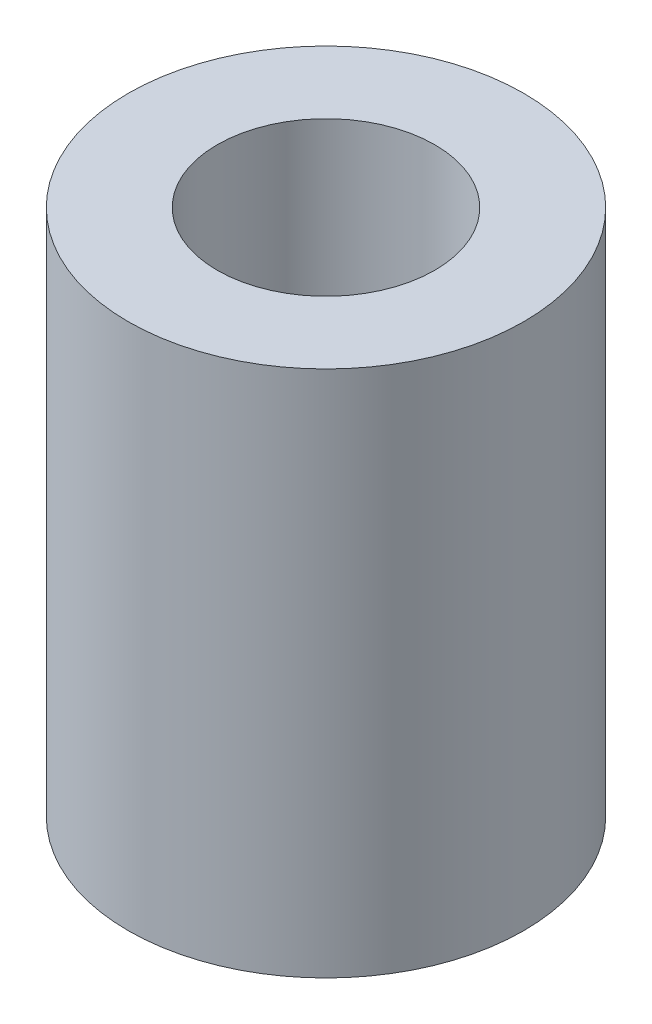
ISO-10303-21;
HEADER;
FILE_DESCRIPTION(('STEP AP214'),'2;1');
FILE_NAME('part.step','',(''),(''),'','','');
FILE_SCHEMA(('AUTOMOTIVE_DESIGN { 1 0 10303 214 1 1 1 1 }'));
ENDSEC;
DATA;
#1=APPLICATION_CONTEXT('core data for automotive mechanical design processes');
#2=APPLICATION_PROTOCOL_DEFINITION('international standard','automotive_design',2000,#1);
#3=PRODUCT_CONTEXT('',#1,'mechanical');
#4=PRODUCT('Part','Part','',(#3));
#5=PRODUCT_RELATED_PRODUCT_CATEGORY('part','',(#4));
#6=PRODUCT_DEFINITION_FORMATION('','',#4);
#7=PRODUCT_DEFINITION_CONTEXT('part definition',#1,'design');
#8=PRODUCT_DEFINITION('design','',#6,#7);
#9=PRODUCT_DEFINITION_SHAPE('','',#8);
#10=(LENGTH_UNIT() NAMED_UNIT(*) SI_UNIT(.MILLI.,.METRE.));
#11=(NAMED_UNIT(*) PLANE_ANGLE_UNIT() SI_UNIT($,.RADIAN.));
#12=(NAMED_UNIT(*) SI_UNIT($,.STERADIAN.) SOLID_ANGLE_UNIT());
#13=UNCERTAINTY_MEASURE_WITH_UNIT(LENGTH_MEASURE(1.E-05),#10,'distance_accuracy_value','');
#14=(GEOMETRIC_REPRESENTATION_CONTEXT(3) GLOBAL_UNCERTAINTY_ASSIGNED_CONTEXT((#13)) GLOBAL_UNIT_ASSIGNED_CONTEXT((#10,
#11,#12)) REPRESENTATION_CONTEXT('',''));
#15=CARTESIAN_POINT('',(0.,0.,0.));
#16=DIRECTION('',(0.,0.,1.));
#17=DIRECTION('',(1.,0.,0.));
#18=AXIS2_PLACEMENT_3D('',#15,#16,#17);
#19=CARTESIAN_POINT('',(0.,8.,0.));
#20=DIRECTION('',(0.,1.,0.));
#21=DIRECTION('',(0.,0.,1.));
#22=AXIS2_PLACEMENT_3D('',#19,#20,#21);
#23=PLANE('',#22);
#24=CARTESIAN_POINT('',(0.,8.,0.));
#25=DIRECTION('',(0.,1.,0.));
#26=DIRECTION('',(0.,0.,1.));
#27=AXIS2_PLACEMENT_3D('',#24,#25,#26);
#28=CIRCLE('',#27,3.);
#29=CARTESIAN_POINT('',(0.,8.,3.));
#30=VERTEX_POINT('',#29);
#31=EDGE_CURVE('E10',#30,#30,#28,.T.);
#32=ORIENTED_EDGE('',*,*,#31,.T.);
#33=EDGE_LOOP('',(#32));
#34=FACE_BOUND('',#33,.T.);
#35=CARTESIAN_POINT('',(0.,8.,0.));
#36=DIRECTION('',(0.,1.,0.));
#37=DIRECTION('',(0.,0.,1.));
#38=AXIS2_PLACEMENT_3D('',#35,#36,#37);
#39=CIRCLE('',#38,1.65);
#40=CARTESIAN_POINT('',(0.,8.,1.65));
#41=VERTEX_POINT('',#40);
#42=EDGE_CURVE('E43',#41,#41,#39,.T.);
#43=ORIENTED_EDGE('',*,*,#42,.F.);
#44=EDGE_LOOP('',(#43));
#45=FACE_BOUND('',#44,.T.);
#46=ADVANCED_FACE('F32',(#34,#45),#23,.T.);
#47=CARTESIAN_POINT('',(0.,0.,0.));
#48=DIRECTION('',(0.,1.,0.));
#49=DIRECTION('',(0.,0.,1.));
#50=AXIS2_PLACEMENT_3D('',#47,#48,#49);
#51=PLANE('',#50);
#52=CARTESIAN_POINT('',(0.,0.,0.));
#53=DIRECTION('',(0.,1.,0.));
#54=DIRECTION('',(0.,0.,1.));
#55=AXIS2_PLACEMENT_3D('',#52,#53,#54);
#56=CIRCLE('',#55,3.);
#57=CARTESIAN_POINT('',(0.,0.,3.));
#58=VERTEX_POINT('',#57);
#59=EDGE_CURVE('E36',#58,#58,#56,.T.);
#60=ORIENTED_EDGE('',*,*,#59,.F.);
#61=EDGE_LOOP('',(#60));
#62=FACE_BOUND('',#61,.T.);
#63=CARTESIAN_POINT('',(0.,0.,0.));
#64=DIRECTION('',(0.,1.,0.));
#65=DIRECTION('',(0.,0.,1.));
#66=AXIS2_PLACEMENT_3D('',#63,#64,#65);
#67=CIRCLE('',#66,1.65);
#68=CARTESIAN_POINT('',(0.,0.,1.65));
#69=VERTEX_POINT('',#68);
#70=EDGE_CURVE('E45',#69,#69,#67,.T.);
#71=ORIENTED_EDGE('',*,*,#70,.T.);
#72=EDGE_LOOP('',(#71));
#73=FACE_BOUND('',#72,.T.);
#74=ADVANCED_FACE('F55',(#62,#73),#51,.F.);
#75=CARTESIAN_POINT('',(0.,8.,0.));
#76=DIRECTION('',(0.,-1.,0.));
#77=DIRECTION('',(0.,0.,-1.));
#78=AXIS2_PLACEMENT_3D('',#75,#76,#77);
#79=CYLINDRICAL_SURFACE('',#78,3.);
#80=ORIENTED_EDGE('',*,*,#31,.F.);
#81=EDGE_LOOP('',(#80));
#82=FACE_BOUND('',#81,.T.);
#83=ORIENTED_EDGE('',*,*,#59,.T.);
#84=EDGE_LOOP('',(#83));
#85=FACE_BOUND('',#84,.T.);
#86=ADVANCED_FACE('F34',(#82,#85),#79,.T.);
#87=CARTESIAN_POINT('',(0.,8.,0.));
#88=DIRECTION('',(0.,-1.,0.));
#89=DIRECTION('',(0.,0.,-1.));
#90=AXIS2_PLACEMENT_3D('',#87,#88,#89);
#91=CYLINDRICAL_SURFACE('',#90,1.65);
#92=ORIENTED_EDGE('',*,*,#42,.T.);
#93=EDGE_LOOP('',(#92));
#94=FACE_BOUND('',#93,.T.);
#95=ORIENTED_EDGE('',*,*,#70,.F.);
#96=EDGE_LOOP('',(#95));
#97=FACE_BOUND('',#96,.T.);
#98=ADVANCED_FACE('F51',(#94,#97),#91,.F.);
#99=CLOSED_SHELL('',(#46,#74,#86,#98));
#100=MANIFOLD_SOLID_BREP('B2',#99);
#101=ADVANCED_BREP_SHAPE_REPRESENTATION('',(#18,#100),#14);
#102=SHAPE_DEFINITION_REPRESENTATION(#9,#101);
ENDSEC;
END-ISO-10303-21;
